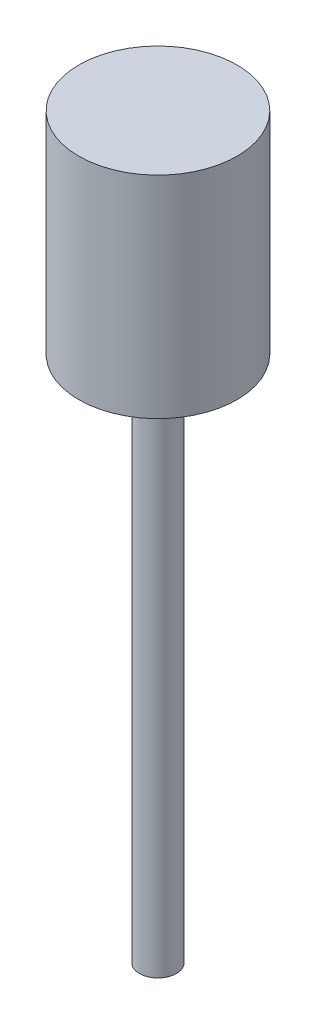
ISO-10303-21;
HEADER;
FILE_DESCRIPTION(('STEP AP214'),'2;1');
FILE_NAME('part.step','',(''),(''),'','','');
FILE_SCHEMA(('AUTOMOTIVE_DESIGN { 1 0 10303 214 1 1 1 1 }'));
ENDSEC;
DATA;
#1=APPLICATION_CONTEXT('core data for automotive mechanical design processes');
#2=APPLICATION_PROTOCOL_DEFINITION('international standard','automotive_design',2000,#1);
#3=PRODUCT_CONTEXT('',#1,'mechanical');
#4=PRODUCT('Part','Part','',(#3));
#5=PRODUCT_RELATED_PRODUCT_CATEGORY('part','',(#4));
#6=PRODUCT_DEFINITION_FORMATION('','',#4);
#7=PRODUCT_DEFINITION_CONTEXT('part definition',#1,'design');
#8=PRODUCT_DEFINITION('design','',#6,#7);
#9=PRODUCT_DEFINITION_SHAPE('','',#8);
#10=(LENGTH_UNIT() NAMED_UNIT(*) SI_UNIT(.MILLI.,.METRE.));
#11=(NAMED_UNIT(*) PLANE_ANGLE_UNIT() SI_UNIT($,.RADIAN.));
#12=(NAMED_UNIT(*) SI_UNIT($,.STERADIAN.) SOLID_ANGLE_UNIT());
#13=UNCERTAINTY_MEASURE_WITH_UNIT(LENGTH_MEASURE(1.E-05),#10,'distance_accuracy_value','');
#14=(GEOMETRIC_REPRESENTATION_CONTEXT(3) GLOBAL_UNCERTAINTY_ASSIGNED_CONTEXT((#13)) GLOBAL_UNIT_ASSIGNED_CONTEXT((#10,
#11,#12)) REPRESENTATION_CONTEXT('',''));
#15=CARTESIAN_POINT('',(0.,0.,0.));
#16=DIRECTION('',(0.,0.,1.));
#17=DIRECTION('',(1.,0.,0.));
#18=AXIS2_PLACEMENT_3D('',#15,#16,#17);
#19=CARTESIAN_POINT('',(0.,127.,0.));
#20=DIRECTION('',(0.,-1.,0.));
#21=DIRECTION('',(0.,0.,-1.));
#22=AXIS2_PLACEMENT_3D('',#19,#20,#21);
#23=CYLINDRICAL_SURFACE('',#22,4.445);
#24=CARTESIAN_POINT('',(0.,127.,0.));
#25=DIRECTION('',(0.,1.,0.));
#26=DIRECTION('',(0.,0.,1.));
#27=AXIS2_PLACEMENT_3D('',#24,#25,#26);
#28=CIRCLE('',#27,4.445);
#29=CARTESIAN_POINT('',(0.,127.,4.445));
#30=VERTEX_POINT('',#29);
#31=EDGE_CURVE('E10',#30,#30,#28,.T.);
#32=ORIENTED_EDGE('',*,*,#31,.F.);
#33=EDGE_LOOP('',(#32));
#34=FACE_BOUND('',#33,.T.);
#35=CARTESIAN_POINT('',(0.,0.,0.));
#36=DIRECTION('',(0.,1.,0.));
#37=DIRECTION('',(0.,0.,1.));
#38=AXIS2_PLACEMENT_3D('',#35,#36,#37);
#39=CIRCLE('',#38,4.445);
#40=CARTESIAN_POINT('',(0.,0.,4.445));
#41=VERTEX_POINT('',#40);
#42=EDGE_CURVE('E39',#41,#41,#39,.T.);
#43=ORIENTED_EDGE('',*,*,#42,.T.);
#44=EDGE_LOOP('',(#43));
#45=FACE_BOUND('',#44,.T.);
#46=ADVANCED_FACE('F36',(#34,#45),#23,.T.);
#47=CARTESIAN_POINT('',(0.,0.,0.));
#48=DIRECTION('',(0.,1.,0.));
#49=DIRECTION('',(0.,0.,1.));
#50=AXIS2_PLACEMENT_3D('',#47,#48,#49);
#51=PLANE('',#50);
#52=ORIENTED_EDGE('',*,*,#42,.F.);
#53=EDGE_LOOP('',(#52));
#54=FACE_BOUND('',#53,.T.);
#55=ADVANCED_FACE('F59',(#54),#51,.F.);
#56=CARTESIAN_POINT('',(0.,177.8,0.));
#57=DIRECTION('',(0.,-1.,0.));
#58=DIRECTION('',(0.,0.,-1.));
#59=AXIS2_PLACEMENT_3D('',#56,#57,#58);
#60=CYLINDRICAL_SURFACE('',#59,19.05);
#61=CARTESIAN_POINT('',(0.,177.8,0.));
#62=DIRECTION('',(0.,1.,0.));
#63=DIRECTION('',(0.,0.,1.));
#64=AXIS2_PLACEMENT_3D('',#61,#62,#63);
#65=CIRCLE('',#64,19.05);
#66=CARTESIAN_POINT('',(0.,177.8,19.05));
#67=VERTEX_POINT('',#66);
#68=EDGE_CURVE('E46',#67,#67,#65,.T.);
#69=ORIENTED_EDGE('',*,*,#68,.F.);
#70=EDGE_LOOP('',(#69));
#71=FACE_BOUND('',#70,.T.);
#72=CARTESIAN_POINT('',(0.,127.,0.));
#73=DIRECTION('',(0.,1.,0.));
#74=DIRECTION('',(0.,0.,1.));
#75=AXIS2_PLACEMENT_3D('',#72,#73,#74);
#76=CIRCLE('',#75,19.05);
#77=CARTESIAN_POINT('',(0.,127.,19.05));
#78=VERTEX_POINT('',#77);
#79=EDGE_CURVE('E48',#78,#78,#76,.T.);
#80=ORIENTED_EDGE('',*,*,#79,.T.);
#81=EDGE_LOOP('',(#80));
#82=FACE_BOUND('',#81,.T.);
#83=ADVANCED_FACE('F56',(#71,#82),#60,.T.);
#84=CARTESIAN_POINT('',(0.,177.8,0.));
#85=DIRECTION('',(0.,1.,0.));
#86=DIRECTION('',(0.,0.,1.));
#87=AXIS2_PLACEMENT_3D('',#84,#85,#86);
#88=PLANE('',#87);
#89=ORIENTED_EDGE('',*,*,#68,.T.);
#90=EDGE_LOOP('',(#89));
#91=FACE_BOUND('',#90,.T.);
#92=ADVANCED_FACE('F54',(#91),#88,.T.);
#93=CARTESIAN_POINT('',(0.,127.,0.));
#94=DIRECTION('',(0.,1.,0.));
#95=DIRECTION('',(0.,0.,1.));
#96=AXIS2_PLACEMENT_3D('',#93,#94,#95);
#97=PLANE('',#96);
#98=ORIENTED_EDGE('',*,*,#31,.T.);
#99=EDGE_LOOP('',(#98));
#100=FACE_BOUND('',#99,.T.);
#101=ORIENTED_EDGE('',*,*,#79,.F.);
#102=EDGE_LOOP('',(#101));
#103=FACE_BOUND('',#102,.T.);
#104=ADVANCED_FACE('F63',(#100,#103),#97,.F.);
#105=CLOSED_SHELL('',(#46,#55,#83,#92,#104));
#106=MANIFOLD_SOLID_BREP('B2',#105);
#107=ADVANCED_BREP_SHAPE_REPRESENTATION('',(#18,#106),#14);
#108=SHAPE_DEFINITION_REPRESENTATION(#9,#107);
ENDSEC;
END-ISO-10303-21;
